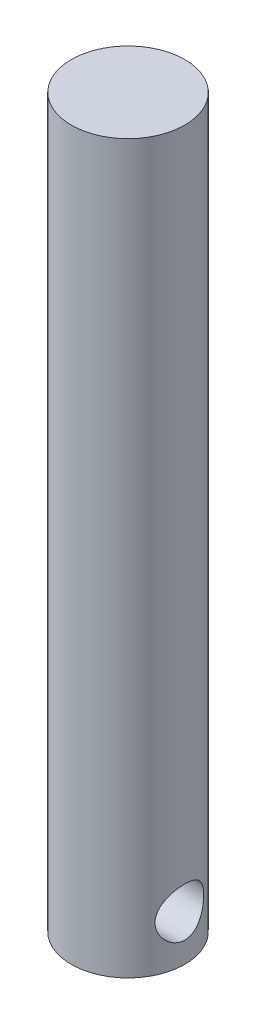
ISO-10303-21;
HEADER;
FILE_DESCRIPTION(('STEP AP214'),'2;1');
FILE_NAME('part.step','',(''),(''),'','','');
FILE_SCHEMA(('AUTOMOTIVE_DESIGN { 1 0 10303 214 1 1 1 1 }'));
ENDSEC;
DATA;
#1=APPLICATION_CONTEXT('core data for automotive mechanical design processes');
#2=APPLICATION_PROTOCOL_DEFINITION('international standard','automotive_design',2000,#1);
#3=PRODUCT_CONTEXT('',#1,'mechanical');
#4=PRODUCT('Part','Part','',(#3));
#5=PRODUCT_RELATED_PRODUCT_CATEGORY('part','',(#4));
#6=PRODUCT_DEFINITION_FORMATION('','',#4);
#7=PRODUCT_DEFINITION_CONTEXT('part definition',#1,'design');
#8=PRODUCT_DEFINITION('design','',#6,#7);
#9=PRODUCT_DEFINITION_SHAPE('','',#8);
#10=(LENGTH_UNIT() NAMED_UNIT(*) SI_UNIT(.MILLI.,.METRE.));
#11=(NAMED_UNIT(*) PLANE_ANGLE_UNIT() SI_UNIT($,.RADIAN.));
#12=(NAMED_UNIT(*) SI_UNIT($,.STERADIAN.) SOLID_ANGLE_UNIT());
#13=UNCERTAINTY_MEASURE_WITH_UNIT(LENGTH_MEASURE(1.E-05),#10,'distance_accuracy_value','');
#14=(GEOMETRIC_REPRESENTATION_CONTEXT(3) GLOBAL_UNCERTAINTY_ASSIGNED_CONTEXT((#13)) GLOBAL_UNIT_ASSIGNED_CONTEXT((#10,
#11,#12)) REPRESENTATION_CONTEXT('',''));
#15=CARTESIAN_POINT('',(0.,0.,0.));
#16=DIRECTION('',(0.,0.,1.));
#17=DIRECTION('',(1.,0.,0.));
#18=AXIS2_PLACEMENT_3D('',#15,#16,#17);
#19=CARTESIAN_POINT('',(0.,50.8,0.));
#20=DIRECTION('',(0.,-1.,0.));
#21=DIRECTION('',(0.,0.,1.));
#22=AXIS2_PLACEMENT_3D('',#19,#20,#21);
#23=CYLINDRICAL_SURFACE('',#22,3.96875);
#24=CARTESIAN_POINT('',(-3.58622037282987,3.175,1.7));
#25=CARTESIAN_POINT('',(-3.58623113706892,3.08459005344208,1.69998911546172));
#26=CARTESIAN_POINT('',(-3.58968938900767,2.99404356277239,1.69274199167995));
#27=CARTESIAN_POINT('',(-3.60307871804978,2.81557963908529,1.6640411575309));
#28=CARTESIAN_POINT('',(-3.61302690266575,2.72766979872845,1.64254989711271));
#29=CARTESIAN_POINT('',(-3.63804219046086,2.55739037711525,1.58636684632454));
#30=CARTESIAN_POINT('',(-3.65308759133628,2.47499905225026,1.55173094765683));
#31=CARTESIAN_POINT('',(-3.68657122753554,2.3172187711832,1.4704064892417));
#32=CARTESIAN_POINT('',(-3.70500879408357,2.24182843911496,1.42372030451515));
#33=CARTESIAN_POINT('',(-3.74455582562221,2.09518271102688,1.31633507475202));
#34=CARTESIAN_POINT('',(-3.76575910737061,2.02444335997849,1.25496554021632));
#35=CARTESIAN_POINT('',(-3.8076796275402,1.8938765569399,1.12136187333479));
#36=CARTESIAN_POINT('',(-3.8283966693971,1.83405345386459,1.04912343175391));
#37=CARTESIAN_POINT('',(-3.86816191973165,1.72433167004081,0.891728093718384));
#38=CARTESIAN_POINT('',(-3.88708845202858,1.67502072481835,0.80612793261505));
#39=CARTESIAN_POINT('',(-3.91998324015899,1.5917241528577,0.626889116143654));
#40=CARTESIAN_POINT('',(-3.93395381514694,1.55773135592966,0.53325424618402));
#41=CARTESIAN_POINT('',(-3.95469596900494,1.5079284067925,0.346028881740543));
#42=CARTESIAN_POINT('',(-3.96181911296762,1.49122644157612,0.252715371302695));
#43=CARTESIAN_POINT('',(-3.96934545838333,1.47359037231403,0.064356867094234));
#44=CARTESIAN_POINT('',(-3.96975155028843,1.47264948602845,-0.0306873642928482));
#45=CARTESIAN_POINT('',(-3.96399993382167,1.48611070884914,-0.213297108302966));
#46=CARTESIAN_POINT('',(-3.95826228294521,1.49953089186249,-0.300950773026008));
#47=CARTESIAN_POINT('',(-3.94145238730588,1.53964056824275,-0.472621705663843));
#48=CARTESIAN_POINT('',(-3.93037974833308,1.56633104217516,-0.556638704360109));
#49=CARTESIAN_POINT('',(-3.90374947102569,1.63253035483458,-0.720204048389507));
#50=CARTESIAN_POINT('',(-3.88812579368853,1.67222909698207,-0.799664337948033));
#51=CARTESIAN_POINT('',(-3.85390657578562,1.76312530568893,-0.951004404799201));
#52=CARTESIAN_POINT('',(-3.83530996854243,1.8143269021171,-1.02288144582381));
#53=CARTESIAN_POINT('',(-3.79537378132377,1.93116868168375,-1.16266167991575));
#54=CARTESIAN_POINT('',(-3.77393305560751,1.99759621203648,-1.22987875853107));
#55=CARTESIAN_POINT('',(-3.73173757559351,2.14080134495101,-1.35252605827245));
#56=CARTESIAN_POINT('',(-3.71098312002685,2.21758338282395,-1.40795120200164));
#57=CARTESIAN_POINT('',(-3.67176355740824,2.38283109399904,-1.50734671475435));
#58=CARTESIAN_POINT('',(-3.65340926120111,2.47162028600367,-1.55082677647832));
#59=CARTESIAN_POINT('',(-3.62240664524944,2.65625415543747,-1.62193371634608));
#60=CARTESIAN_POINT('',(-3.60975397811487,2.75209339224905,-1.64957267743231));
#61=CARTESIAN_POINT('',(-3.59268323727969,2.94121847824614,-1.68641381079726));
#62=CARTESIAN_POINT('',(-3.58776749724183,3.03424084026704,-1.69673336462996));
#63=CARTESIAN_POINT('',(-3.58530184937887,3.2207980552888,-1.70194025822124));
#64=CARTESIAN_POINT('',(-3.5877491419163,3.31433270000521,-1.69683346351972));
#65=CARTESIAN_POINT('',(-3.59921731420729,3.49241412668582,-1.67235374478536));
#66=CARTESIAN_POINT('',(-3.60777054658429,3.57713436986088,-1.653994735474));
#67=CARTESIAN_POINT('',(-3.62987674405693,3.74221182744115,-1.60489586590083));
#68=CARTESIAN_POINT('',(-3.64343092274405,3.82256797736696,-1.57415300025295));
#69=CARTESIAN_POINT('',(-3.6747268969317,3.98054569750963,-1.49968412721792));
#70=CARTESIAN_POINT('',(-3.69262508180863,4.05789666043565,-1.45545195142779));
#71=CARTESIAN_POINT('',(-3.73038151502514,4.20446332016495,-1.35575407279594));
#72=CARTESIAN_POINT('',(-3.7502406424614,4.27367533751209,-1.30028331983657));
#73=CARTESIAN_POINT('',(-3.79176455129882,4.40826919257133,-1.17400308940507));
#74=CARTESIAN_POINT('',(-3.81343616572478,4.47279446689132,-1.1022791902822));
#75=CARTESIAN_POINT('',(-3.85455404679553,4.58906239695361,-0.948533416909004));
#76=CARTESIAN_POINT('',(-3.87400009165408,4.64080377932815,-0.866510518030355));
#77=CARTESIAN_POINT('',(-3.90865457956745,4.73009137953567,-0.693679406401621));
#78=CARTESIAN_POINT('',(-3.92384194401562,4.7675673052295,-0.60283039006871));
#79=CARTESIAN_POINT('',(-3.94809086795851,4.82641480522334,-0.415295380859746));
#80=CARTESIAN_POINT('',(-3.95715630336448,4.84779657003157,-0.318613123443799));
#81=CARTESIAN_POINT('',(-3.96767127075444,4.8725130831658,-0.129788880179495));
#82=CARTESIAN_POINT('',(-3.96962935609121,4.87705346004854,-0.0378320493048763));
#83=CARTESIAN_POINT('',(-3.96714023501053,4.87124100800158,0.145510784931608));
#84=CARTESIAN_POINT('',(-3.96269426781214,4.86089106043125,0.236896895294529));
#85=CARTESIAN_POINT('',(-3.94817145617615,4.82645685339129,0.412811561785949));
#86=CARTESIAN_POINT('',(-3.93832136204818,4.80292490796238,0.497468546509107));
#87=CARTESIAN_POINT('',(-3.9140982764196,4.74341486237072,0.661587998364473));
#88=CARTESIAN_POINT('',(-3.8997244519767,4.70743446998762,0.741049505610523));
#89=CARTESIAN_POINT('',(-3.8670169985917,4.62222481149873,0.89652381189233));
#90=CARTESIAN_POINT('',(-3.84853264024002,4.57246602223183,0.97221391607124));
#91=CARTESIAN_POINT('',(-3.80976603642735,4.46186487546169,1.11449824350403));
#92=CARTESIAN_POINT('',(-3.78948308203129,4.4010181374709,1.18108885358492));
#93=CARTESIAN_POINT('',(-3.74754436850339,4.26477474597478,1.30831783828415));
#94=CARTESIAN_POINT('',(-3.72589576200376,4.18864279864083,1.368173975489));
#95=CARTESIAN_POINT('',(-3.68515605259579,4.02677477679791,1.47439832182803));
#96=CARTESIAN_POINT('',(-3.66606644026516,3.94103315771583,1.52075868812735));
#97=CARTESIAN_POINT('',(-3.63291840219493,3.76221239686101,1.59833196339931));
#98=CARTESIAN_POINT('',(-3.61885058446783,3.66914735395346,1.62957318823252));
#99=CARTESIAN_POINT('',(-3.59780126037644,3.47844788022475,1.67555044144813));
#100=CARTESIAN_POINT('',(-3.59079599179021,3.38082993573814,1.69034183337361));
#101=CARTESIAN_POINT('',(-3.58675667806582,3.24686351662433,1.69886499090494));
#102=CARTESIAN_POINT('',(-3.58621609349779,3.21094254848225,1.70000432715713));
#103=CARTESIAN_POINT('',(-3.58622037282987,3.175,1.7));
#104=B_SPLINE_CURVE_WITH_KNOTS('',3,(#24,#25,#26,#27,#28,#29,#30,#31,#32,#33,#34,#35,#36,#37,
#38,#39,#40,#41,#42,#43,#44,#45,#46,#47,#48,#49,#50,#51,#52,#53,#54,#55,#56,#57,#58,#59,#60,#61,
#62,#63,#64,#65,#66,#67,#68,#69,#70,#71,#72,#73,#74,#75,#76,#77,#78,#79,#80,#81,#82,#83,#84,#85,
#86,#87,#88,#89,#90,#91,#92,#93,#94,#95,#96,#97,#98,#99,#100,#101,#102,#103),.UNSPECIFIED.,.T.,
.F.,(4,2,2,2,2,2,2,2,2,2,2,2,2,2,2,2,2,2,2,2,2,2,2,2,2,2,2,2,2,2,2,2,2,2,2,2,2,2,2,4),(0.,
0.271122267186831,0.542962118356002,0.813658812563502,1.08430219517141,1.37111310872573,
1.65803803635866,1.95824745055016,2.25831619498843,2.5419933352771,2.82554840169842,
3.09088463268955,3.35624047276307,3.62565692960539,3.89517027003921,4.18459901178047,
4.474152125282,4.77424342805826,5.07410552781407,5.35375082399783,5.63328980440983,
5.89344279537735,6.15365895985511,6.42518379870137,6.69683092044961,6.99210230451842,
7.2874030878983,7.58414067105511,7.88069020735217,8.15554910363005,8.43035482035872,
8.69442547174946,8.95854477423391,9.23471297067145,9.51099050964756,9.80731026576914,
10.103801880814,10.3997360421804,10.6946711649093,10.8024560448255),.UNSPECIFIED.);
#105=CARTESIAN_POINT('',(-3.58622037282987,3.175,1.7));
#106=VERTEX_POINT('',#105);
#107=EDGE_CURVE('E49',#106,#106,#104,.T.);
#108=ORIENTED_EDGE('',*,*,#107,.T.);
#109=EDGE_LOOP('',(#108));
#110=FACE_BOUND('',#109,.T.);
#111=CARTESIAN_POINT('',(3.58622037282987,3.175,1.7));
#112=CARTESIAN_POINT('',(3.58623113706892,3.26540994655792,1.69998911546172));
#113=CARTESIAN_POINT('',(3.58968938900767,3.35595643722761,1.69274199167995));
#114=CARTESIAN_POINT('',(3.60307871804978,3.53442036091471,1.6640411575309));
#115=CARTESIAN_POINT('',(3.61302690266575,3.62233020127155,1.64254989711271));
#116=CARTESIAN_POINT('',(3.63804219046086,3.79260962288475,1.58636684632454));
#117=CARTESIAN_POINT('',(3.65308759133628,3.87500094774974,1.55173094765683));
#118=CARTESIAN_POINT('',(3.68657122753554,4.0327812288168,1.4704064892417));
#119=CARTESIAN_POINT('',(3.70500879408357,4.10817156088504,1.42372030451515));
#120=CARTESIAN_POINT('',(3.74455582562221,4.25481728897312,1.31633507475202));
#121=CARTESIAN_POINT('',(3.76575910737061,4.32555664002151,1.25496554021632));
#122=CARTESIAN_POINT('',(3.8076796275402,4.4561234430601,1.12136187333479));
#123=CARTESIAN_POINT('',(3.8283966693971,4.51594654613541,1.04912343175391));
#124=CARTESIAN_POINT('',(3.86816191973165,4.62566832995919,0.891728093718384));
#125=CARTESIAN_POINT('',(3.88708845202858,4.67497927518165,0.80612793261505));
#126=CARTESIAN_POINT('',(3.91998324015899,4.7582758471423,0.626889116143653));
#127=CARTESIAN_POINT('',(3.93395381514694,4.79226864407034,0.533254246184019));
#128=CARTESIAN_POINT('',(3.95469596900494,4.8420715932075,0.346028881740543));
#129=CARTESIAN_POINT('',(3.96181911296762,4.85877355842388,0.252715371302695));
#130=CARTESIAN_POINT('',(3.96934545838333,4.87640962768597,0.0643568670942337));
#131=CARTESIAN_POINT('',(3.96975155028843,4.87735051397155,-0.0306873642928486));
#132=CARTESIAN_POINT('',(3.96399993382167,4.86388929115086,-0.213297108302967));
#133=CARTESIAN_POINT('',(3.95826228294521,4.85046910813751,-0.300950773026008));
#134=CARTESIAN_POINT('',(3.94145238730588,4.81035943175725,-0.472621705663843));
#135=CARTESIAN_POINT('',(3.93037974833308,4.78366895782484,-0.556638704360109));
#136=CARTESIAN_POINT('',(3.90374947102569,4.71746964516542,-0.720204048389507));
#137=CARTESIAN_POINT('',(3.88812579368853,4.67777090301793,-0.799664337948034));
#138=CARTESIAN_POINT('',(3.85390657578562,4.58687469431107,-0.951004404799202));
#139=CARTESIAN_POINT('',(3.83530996854243,4.5356730978829,-1.02288144582381));
#140=CARTESIAN_POINT('',(3.79537378132377,4.41883131831625,-1.16266167991575));
#141=CARTESIAN_POINT('',(3.77393305560751,4.35240378796352,-1.22987875853107));
#142=CARTESIAN_POINT('',(3.73173757559351,4.20919865504899,-1.35252605827245));
#143=CARTESIAN_POINT('',(3.71098312002685,4.13241661717605,-1.40795120200164));
#144=CARTESIAN_POINT('',(3.67176355740824,3.96716890600096,-1.50734671475435));
#145=CARTESIAN_POINT('',(3.65340926120111,3.87837971399633,-1.55082677647832));
#146=CARTESIAN_POINT('',(3.62240664524944,3.69374584456253,-1.62193371634609));
#147=CARTESIAN_POINT('',(3.60975397811487,3.59790660775095,-1.64957267743231));
#148=CARTESIAN_POINT('',(3.59268323727969,3.40878152175386,-1.68641381079726));
#149=CARTESIAN_POINT('',(3.58776749724183,3.31575915973296,-1.69673336462996));
#150=CARTESIAN_POINT('',(3.58530184937887,3.1292019447112,-1.70194025822124));
#151=CARTESIAN_POINT('',(3.5877491419163,3.03566729999478,-1.69683346351972));
#152=CARTESIAN_POINT('',(3.59921731420729,2.85758587331418,-1.67235374478536));
#153=CARTESIAN_POINT('',(3.60777054658429,2.77286563013912,-1.653994735474));
#154=CARTESIAN_POINT('',(3.62987674405693,2.60778817255885,-1.60489586590083));
#155=CARTESIAN_POINT('',(3.64343092274405,2.52743202263304,-1.57415300025295));
#156=CARTESIAN_POINT('',(3.6747268969317,2.36945430249037,-1.49968412721792));
#157=CARTESIAN_POINT('',(3.69262508180863,2.29210333956435,-1.45545195142779));
#158=CARTESIAN_POINT('',(3.73038151502514,2.14553667983505,-1.35575407279594));
#159=CARTESIAN_POINT('',(3.7502406424614,2.07632466248791,-1.30028331983657));
#160=CARTESIAN_POINT('',(3.79176455129882,1.94173080742867,-1.17400308940507));
#161=CARTESIAN_POINT('',(3.81343616572478,1.87720553310868,-1.1022791902822));
#162=CARTESIAN_POINT('',(3.85455404679553,1.76093760304639,-0.948533416909004));
#163=CARTESIAN_POINT('',(3.87400009165408,1.70919622067185,-0.866510518030355));
#164=CARTESIAN_POINT('',(3.90865457956745,1.61990862046433,-0.693679406401621));
#165=CARTESIAN_POINT('',(3.92384194401562,1.5824326947705,-0.60283039006871));
#166=CARTESIAN_POINT('',(3.94809086795851,1.52358519477665,-0.415295380859746));
#167=CARTESIAN_POINT('',(3.95715630336448,1.50220342996843,-0.318613123443799));
#168=CARTESIAN_POINT('',(3.96767127075444,1.4774869168342,-0.129788880179494));
#169=CARTESIAN_POINT('',(3.96962935609121,1.47294653995146,-0.0378320493048759));
#170=CARTESIAN_POINT('',(3.96714023501053,1.47875899199842,0.145510784931608));
#171=CARTESIAN_POINT('',(3.96269426781214,1.48910893956875,0.23689689529453));
#172=CARTESIAN_POINT('',(3.94817145617615,1.52354314660871,0.412811561785949));
#173=CARTESIAN_POINT('',(3.93832136204818,1.54707509203762,0.497468546509107));
#174=CARTESIAN_POINT('',(3.9140982764196,1.60658513762928,0.661587998364473));
#175=CARTESIAN_POINT('',(3.8997244519767,1.64256553001238,0.741049505610523));
#176=CARTESIAN_POINT('',(3.8670169985917,1.72777518850127,0.89652381189233));
#177=CARTESIAN_POINT('',(3.84853264024002,1.77753397776817,0.972213916071241));
#178=CARTESIAN_POINT('',(3.80976603642735,1.88813512453831,1.11449824350403));
#179=CARTESIAN_POINT('',(3.78948308203129,1.9489818625291,1.18108885358492));
#180=CARTESIAN_POINT('',(3.74754436850339,2.08522525402522,1.30831783828415));
#181=CARTESIAN_POINT('',(3.72589576200376,2.16135720135917,1.368173975489));
#182=CARTESIAN_POINT('',(3.68515605259579,2.32322522320209,1.47439832182803));
#183=CARTESIAN_POINT('',(3.66606644026516,2.40896684228417,1.52075868812735));
#184=CARTESIAN_POINT('',(3.63291840219493,2.58778760313899,1.59833196339931));
#185=CARTESIAN_POINT('',(3.61885058446783,2.68085264604654,1.62957318823252));
#186=CARTESIAN_POINT('',(3.59780126037644,2.87155211977525,1.67555044144813));
#187=CARTESIAN_POINT('',(3.59079599179021,2.96917006426187,1.69034183337361));
#188=CARTESIAN_POINT('',(3.58675667806582,3.10313648337567,1.69886499090494));
#189=CARTESIAN_POINT('',(3.58621609349779,3.13905745151775,1.70000432715713));
#190=CARTESIAN_POINT('',(3.58622037282987,3.175,1.7));
#191=B_SPLINE_CURVE_WITH_KNOTS('',3,(#111,#112,#113,#114,#115,#116,#117,#118,#119,#120,#121,
#122,#123,#124,#125,#126,#127,#128,#129,#130,#131,#132,#133,#134,#135,#136,#137,#138,#139,#140,
#141,#142,#143,#144,#145,#146,#147,#148,#149,#150,#151,#152,#153,#154,#155,#156,#157,#158,#159,
#160,#161,#162,#163,#164,#165,#166,#167,#168,#169,#170,#171,#172,#173,#174,#175,#176,#177,#178,
#179,#180,#181,#182,#183,#184,#185,#186,#187,#188,#189,#190),.UNSPECIFIED.,.T.,.F.,(4,2,2,2,2,2,
2,2,2,2,2,2,2,2,2,2,2,2,2,2,2,2,2,2,2,2,2,2,2,2,2,2,2,2,2,2,2,2,2,4),(0.,0.271122267186831,
0.542962118356002,0.813658812563503,1.08430219517141,1.37111310872573,1.65803803635866,
1.95824745055017,2.25831619498843,2.5419933352771,2.82554840169842,3.09088463268955,
3.35624047276307,3.62565692960539,3.89517027003921,4.18459901178047,4.474152125282,
4.77424342805826,5.07410552781407,5.35375082399783,5.63328980440982,5.89344279537735,
6.15365895985511,6.42518379870137,6.69683092044961,6.99210230451842,7.2874030878983,
7.58414067105511,7.88069020735217,8.15554910363005,8.43035482035872,8.69442547174946,
8.95854477423391,9.23471297067144,9.51099050964756,9.80731026576914,10.1038018808139,
10.3997360421804,10.6946711649093,10.8024560448255),.UNSPECIFIED.);
#192=CARTESIAN_POINT('',(3.58622037282987,3.175,1.7));
#193=VERTEX_POINT('',#192);
#194=EDGE_CURVE('E58',#193,#193,#191,.T.);
#195=ORIENTED_EDGE('',*,*,#194,.T.);
#196=EDGE_LOOP('',(#195));
#197=FACE_BOUND('',#196,.T.);
#198=CARTESIAN_POINT('',(0.,50.8,0.));
#199=DIRECTION('',(0.,-1.,0.));
#200=DIRECTION('',(0.,0.,-1.));
#201=AXIS2_PLACEMENT_3D('',#198,#199,#200);
#202=CIRCLE('',#201,3.96875);
#203=CARTESIAN_POINT('',(0.,50.8,-3.96875));
#204=VERTEX_POINT('',#203);
#205=EDGE_CURVE('E10',#204,#204,#202,.T.);
#206=ORIENTED_EDGE('',*,*,#205,.T.);
#207=EDGE_LOOP('',(#206));
#208=FACE_BOUND('',#207,.T.);
#209=CARTESIAN_POINT('',(0.,0.,0.));
#210=DIRECTION('',(0.,-1.,0.));
#211=DIRECTION('',(0.,0.,-1.));
#212=AXIS2_PLACEMENT_3D('',#209,#210,#211);
#213=CIRCLE('',#212,3.96875);
#214=CARTESIAN_POINT('',(0.,0.,-3.96875));
#215=VERTEX_POINT('',#214);
#216=EDGE_CURVE('E42',#215,#215,#213,.T.);
#217=ORIENTED_EDGE('',*,*,#216,.F.);
#218=EDGE_LOOP('',(#217));
#219=FACE_BOUND('',#218,.T.);
#220=ADVANCED_FACE('F39',(#110,#197,#208,#219),#23,.T.);
#221=CARTESIAN_POINT('',(0.,50.8,0.));
#222=DIRECTION('',(0.,1.,0.));
#223=DIRECTION('',(0.,0.,-1.));
#224=AXIS2_PLACEMENT_3D('',#221,#222,#223);
#225=PLANE('',#224);
#226=ORIENTED_EDGE('',*,*,#205,.F.);
#227=EDGE_LOOP('',(#226));
#228=FACE_BOUND('',#227,.T.);
#229=ADVANCED_FACE('F69',(#228),#225,.T.);
#230=CARTESIAN_POINT('',(0.,0.,0.));
#231=DIRECTION('',(0.,1.,0.));
#232=DIRECTION('',(0.,0.,-1.));
#233=AXIS2_PLACEMENT_3D('',#230,#231,#232);
#234=PLANE('',#233);
#235=ORIENTED_EDGE('',*,*,#216,.T.);
#236=EDGE_LOOP('',(#235));
#237=FACE_BOUND('',#236,.T.);
#238=ADVANCED_FACE('F67',(#237),#234,.F.);
#239=CARTESIAN_POINT('',(-3.96975,3.175,0.));
#240=DIRECTION('',(1.,0.,0.));
#241=DIRECTION('',(0.,0.,1.));
#242=AXIS2_PLACEMENT_3D('',#239,#240,#241);
#243=CYLINDRICAL_SURFACE('',#242,1.7);
#244=ORIENTED_EDGE('',*,*,#194,.F.);
#245=EDGE_LOOP('',(#244));
#246=FACE_BOUND('',#245,.T.);
#247=ORIENTED_EDGE('',*,*,#107,.F.);
#248=EDGE_LOOP('',(#247));
#249=FACE_BOUND('',#248,.T.);
#250=ADVANCED_FACE('F63',(#246,#249),#243,.F.);
#251=CLOSED_SHELL('',(#220,#229,#238,#250));
#252=MANIFOLD_SOLID_BREP('B2',#251);
#253=ADVANCED_BREP_SHAPE_REPRESENTATION('',(#18,#252),#14);
#254=SHAPE_DEFINITION_REPRESENTATION(#9,#253);
ENDSEC;
END-ISO-10303-21;
